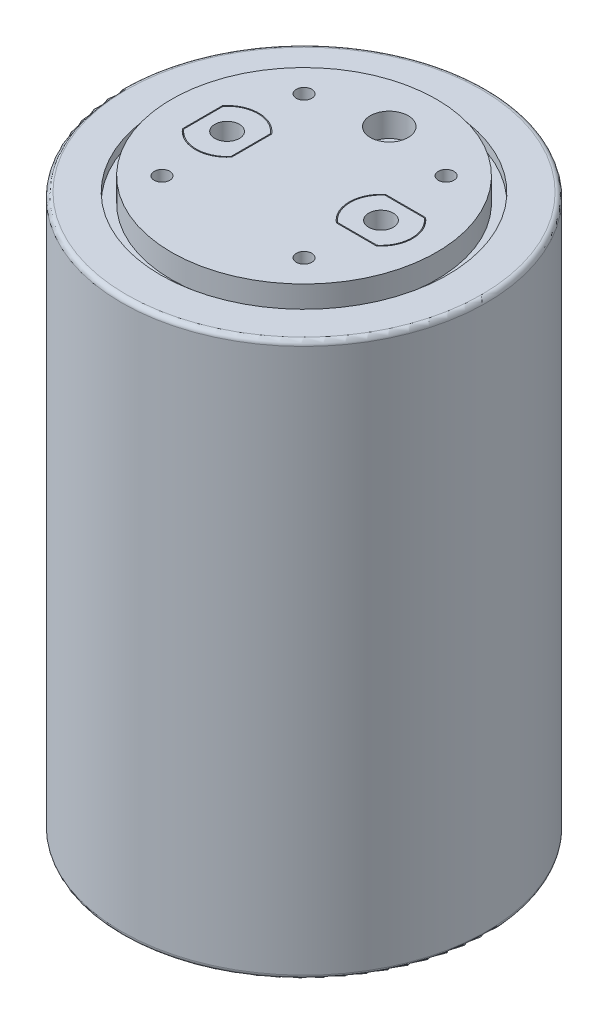
ISO-10303-21;
HEADER;
FILE_DESCRIPTION(('STEP AP214'),'2;1');
FILE_NAME('part.step','',(''),(''),'','','');
FILE_SCHEMA(('AUTOMOTIVE_DESIGN { 1 0 10303 214 1 1 1 1 }'));
ENDSEC;
DATA;
#1=APPLICATION_CONTEXT('core data for automotive mechanical design processes');
#2=APPLICATION_PROTOCOL_DEFINITION('international standard','automotive_design',2000,#1);
#3=PRODUCT_CONTEXT('',#1,'mechanical');
#4=PRODUCT('Part','Part','',(#3));
#5=PRODUCT_RELATED_PRODUCT_CATEGORY('part','',(#4));
#6=PRODUCT_DEFINITION_FORMATION('','',#4);
#7=PRODUCT_DEFINITION_CONTEXT('part definition',#1,'design');
#8=PRODUCT_DEFINITION('design','',#6,#7);
#9=PRODUCT_DEFINITION_SHAPE('','',#8);
#10=(LENGTH_UNIT() NAMED_UNIT(*) SI_UNIT(.MILLI.,.METRE.));
#11=(NAMED_UNIT(*) PLANE_ANGLE_UNIT() SI_UNIT($,.RADIAN.));
#12=(NAMED_UNIT(*) SI_UNIT($,.STERADIAN.) SOLID_ANGLE_UNIT());
#13=UNCERTAINTY_MEASURE_WITH_UNIT(LENGTH_MEASURE(1.E-05),#10,'distance_accuracy_value','');
#14=(GEOMETRIC_REPRESENTATION_CONTEXT(3) GLOBAL_UNCERTAINTY_ASSIGNED_CONTEXT((#13)) GLOBAL_UNIT_ASSIGNED_CONTEXT((#10,
#11,#12)) REPRESENTATION_CONTEXT('',''));
#15=CARTESIAN_POINT('',(0.,0.,0.));
#16=DIRECTION('',(0.,0.,1.));
#17=DIRECTION('',(1.,0.,0.));
#18=AXIS2_PLACEMENT_3D('',#15,#16,#17);
#19=CARTESIAN_POINT('',(1.1478244810946,63.4471649497469,37.8154701534106));
#20=DIRECTION('',(0.,1.,0.));
#21=DIRECTION('',(0.,0.,1.));
#22=AXIS2_PLACEMENT_3D('',#19,#20,#21);
#23=PLANE('',#22);
#24=CARTESIAN_POINT('',(-13.8521755189054,63.4471649497469,52.8154701534106));
#25=DIRECTION('',(0.,1.,0.));
#26=DIRECTION('',(0.,0.,-1.));
#27=AXIS2_PLACEMENT_3D('',#24,#25,#26);
#28=CIRCLE('',#27,1.65);
#29=CARTESIAN_POINT('',(-13.8521755189054,63.4471649497469,51.1654701534106));
#30=VERTEX_POINT('',#29);
#31=EDGE_CURVE('E214',#30,#30,#28,.T.);
#32=ORIENTED_EDGE('',*,*,#31,.F.);
#33=EDGE_LOOP('',(#32));
#34=FACE_BOUND('',#33,.T.);
#35=CARTESIAN_POINT('',(16.1478244810946,63.4471649497469,52.8154701534106));
#36=DIRECTION('',(0.,1.,0.));
#37=DIRECTION('',(0.,0.,1.));
#38=AXIS2_PLACEMENT_3D('',#35,#36,#37);
#39=CIRCLE('',#38,1.65);
#40=CARTESIAN_POINT('',(16.1478244810946,63.4471649497469,54.4654701534106));
#41=VERTEX_POINT('',#40);
#42=EDGE_CURVE('E232',#41,#41,#39,.T.);
#43=ORIENTED_EDGE('',*,*,#42,.F.);
#44=EDGE_LOOP('',(#43));
#45=FACE_BOUND('',#44,.T.);
#46=CARTESIAN_POINT('',(1.1478244810946,63.4471649497469,37.8154701534106));
#47=DIRECTION('',(0.,1.,0.));
#48=DIRECTION('',(0.,0.,1.));
#49=AXIS2_PLACEMENT_3D('',#46,#47,#48);
#50=CIRCLE('',#49,28.);
#51=CARTESIAN_POINT('',(1.1478244810946,63.4471649497469,65.8154701534106));
#52=VERTEX_POINT('',#51);
#53=EDGE_CURVE('E13',#52,#52,#50,.T.);
#54=ORIENTED_EDGE('',*,*,#53,.T.);
#55=EDGE_LOOP('',(#54));
#56=FACE_BOUND('',#55,.T.);
#57=CARTESIAN_POINT('',(-13.8521755189054,63.4471649497469,22.8154701534106));
#58=DIRECTION('',(0.,1.,0.));
#59=DIRECTION('',(0.,0.,-1.));
#60=AXIS2_PLACEMENT_3D('',#57,#58,#59);
#61=CIRCLE('',#60,1.65);
#62=CARTESIAN_POINT('',(-13.8521755189054,63.4471649497469,21.1654701534106));
#63=VERTEX_POINT('',#62);
#64=EDGE_CURVE('E240',#63,#63,#61,.T.);
#65=ORIENTED_EDGE('',*,*,#64,.F.);
#66=EDGE_LOOP('',(#65));
#67=FACE_BOUND('',#66,.T.);
#68=CARTESIAN_POINT('',(16.1478244810946,63.4471649497469,22.8154701534106));
#69=DIRECTION('',(0.,1.,0.));
#70=DIRECTION('',(0.,0.,1.));
#71=AXIS2_PLACEMENT_3D('',#68,#69,#70);
#72=CIRCLE('',#71,1.65);
#73=CARTESIAN_POINT('',(16.1478244810946,63.4471649497469,24.4654701534106));
#74=VERTEX_POINT('',#73);
#75=EDGE_CURVE('E222',#74,#74,#72,.T.);
#76=ORIENTED_EDGE('',*,*,#75,.F.);
#77=EDGE_LOOP('',(#76));
#78=FACE_BOUND('',#77,.T.);
#79=CARTESIAN_POINT('',(1.1478244810946,63.4471649497469,19.8154701534106));
#80=DIRECTION('',(0.,1.,0.));
#81=DIRECTION('',(0.,0.,1.));
#82=AXIS2_PLACEMENT_3D('',#79,#80,#81);
#83=CIRCLE('',#82,4.);
#84=CARTESIAN_POINT('',(1.1478244810946,63.4471649497469,23.8154701534106));
#85=VERTEX_POINT('',#84);
#86=EDGE_CURVE('E207',#85,#85,#83,.T.);
#87=ORIENTED_EDGE('',*,*,#86,.F.);
#88=EDGE_LOOP('',(#87));
#89=FACE_BOUND('',#88,.T.);
#90=DIRECTION('',(0.,0.,1.));
#91=VECTOR('',#90,1.);
#92=CARTESIAN_POINT('',(-20.3021755189054,63.4471649497469,33.5905441185551));
#93=LINE('',#92,#91);
#94=CARTESIAN_POINT('',(-20.3021755189054,63.4471649497469,33.5905441185551));
#95=VERTEX_POINT('',#94);
#96=CARTESIAN_POINT('',(-20.3021755189054,63.4471649497469,42.0403961882661));
#97=VERTEX_POINT('',#96);
#98=EDGE_CURVE('E167',#95,#97,#93,.T.);
#99=ORIENTED_EDGE('',*,*,#98,.F.);
#100=CARTESIAN_POINT('',(-15.1021755189054,63.4471649497469,37.8154701534106));
#101=DIRECTION('',(0.,1.,0.));
#102=DIRECTION('',(0.,0.,1.));
#103=AXIS2_PLACEMENT_3D('',#100,#101,#102);
#104=CIRCLE('',#103,6.69999999999999);
#105=CARTESIAN_POINT('',(-9.9021755189054,63.4471649497469,33.5905441185551));
#106=VERTEX_POINT('',#105);
#107=EDGE_CURVE('E165',#106,#95,#104,.T.);
#108=ORIENTED_EDGE('',*,*,#107,.F.);
#109=DIRECTION('',(0.,0.,-1.));
#110=VECTOR('',#109,1.);
#111=CARTESIAN_POINT('',(-9.9021755189054,63.4471649497469,42.0403961882661));
#112=LINE('',#111,#110);
#113=CARTESIAN_POINT('',(-9.9021755189054,63.4471649497469,42.0403961882661));
#114=VERTEX_POINT('',#113);
#115=EDGE_CURVE('E173',#114,#106,#112,.T.);
#116=ORIENTED_EDGE('',*,*,#115,.F.);
#117=CARTESIAN_POINT('',(-15.1021755189054,63.4471649497469,37.8154701534106));
#118=DIRECTION('',(0.,1.,0.));
#119=DIRECTION('',(0.,0.,1.));
#120=AXIS2_PLACEMENT_3D('',#117,#118,#119);
#121=CIRCLE('',#120,6.7);
#122=EDGE_CURVE('E170',#97,#114,#121,.T.);
#123=ORIENTED_EDGE('',*,*,#122,.F.);
#124=EDGE_LOOP('',(#99,#108,#116,#123));
#125=FACE_BOUND('',#124,.T.);
#126=DIRECTION('',(-1.,0.,0.));
#127=VECTOR('',#126,1.);
#128=CARTESIAN_POINT('',(21.6227505159501,63.4471649497469,32.6154701534106));
#129=LINE('',#128,#127);
#130=CARTESIAN_POINT('',(21.6227505159501,63.4471649497469,32.6154701534106));
#131=VERTEX_POINT('',#130);
#132=CARTESIAN_POINT('',(13.1728984462391,63.4471649497469,32.6154701534106));
#133=VERTEX_POINT('',#132);
#134=EDGE_CURVE('E126',#131,#133,#129,.T.);
#135=ORIENTED_EDGE('',*,*,#134,.F.);
#136=CARTESIAN_POINT('',(17.3978244810946,63.4471649497469,37.8154701534106));
#137=DIRECTION('',(0.,1.,0.));
#138=DIRECTION('',(0.,0.,1.));
#139=AXIS2_PLACEMENT_3D('',#136,#137,#138);
#140=CIRCLE('',#139,6.7);
#141=CARTESIAN_POINT('',(21.6227505159501,63.4471649497469,43.0154701534106));
#142=VERTEX_POINT('',#141);
#143=EDGE_CURVE('E118',#142,#131,#140,.T.);
#144=ORIENTED_EDGE('',*,*,#143,.F.);
#145=DIRECTION('',(1.,0.,0.));
#146=VECTOR('',#145,1.);
#147=CARTESIAN_POINT('',(13.1728984462391,63.4471649497469,43.0154701534106));
#148=LINE('',#147,#146);
#149=CARTESIAN_POINT('',(13.1728984462391,63.4471649497469,43.0154701534106));
#150=VERTEX_POINT('',#149);
#151=EDGE_CURVE('E140',#150,#142,#148,.T.);
#152=ORIENTED_EDGE('',*,*,#151,.F.);
#153=CARTESIAN_POINT('',(17.3978244810946,63.4471649497469,37.8154701534106));
#154=DIRECTION('',(0.,1.,0.));
#155=DIRECTION('',(0.,0.,1.));
#156=AXIS2_PLACEMENT_3D('',#153,#154,#155);
#157=CIRCLE('',#156,6.70000000000001);
#158=EDGE_CURVE('E138',#133,#150,#157,.T.);
#159=ORIENTED_EDGE('',*,*,#158,.F.);
#160=EDGE_LOOP('',(#135,#144,#152,#159));
#161=FACE_BOUND('',#160,.T.);
#162=ADVANCED_FACE('F52',(#34,#45,#56,#67,#78,#89,#125,#161),#23,.T.);
#163=CARTESIAN_POINT('',(1.1478244810946,58.4471649497469,37.8154701534106));
#164=DIRECTION('',(0.,1.,0.));
#165=DIRECTION('',(0.,0.,1.));
#166=AXIS2_PLACEMENT_3D('',#163,#164,#165);
#167=PLANE('',#166);
#168=CARTESIAN_POINT('',(-15.1021755189054,58.4471649497469,37.8154701534106));
#169=DIRECTION('',(0.,1.,0.));
#170=DIRECTION('',(0.,0.,1.));
#171=AXIS2_PLACEMENT_3D('',#168,#169,#170);
#172=CIRCLE('',#171,6.69999999999999);
#173=CARTESIAN_POINT('',(-9.9021755189054,58.4471649497469,33.5905441185551));
#174=VERTEX_POINT('',#173);
#175=CARTESIAN_POINT('',(-20.3021755189054,58.4471649497469,33.5905441185551));
#176=VERTEX_POINT('',#175);
#177=EDGE_CURVE('E134',#174,#176,#172,.T.);
#178=ORIENTED_EDGE('',*,*,#177,.T.);
#179=DIRECTION('',(0.,0.,1.));
#180=VECTOR('',#179,1.);
#181=CARTESIAN_POINT('',(-20.3021755189054,58.4471649497469,33.5905441185551));
#182=LINE('',#181,#180);
#183=CARTESIAN_POINT('',(-20.3021755189054,58.4471649497469,42.0403961882661));
#184=VERTEX_POINT('',#183);
#185=EDGE_CURVE('E180',#176,#184,#182,.T.);
#186=ORIENTED_EDGE('',*,*,#185,.T.);
#187=CARTESIAN_POINT('',(-15.1021755189054,58.4471649497469,37.8154701534106));
#188=DIRECTION('',(0.,1.,0.));
#189=DIRECTION('',(0.,0.,1.));
#190=AXIS2_PLACEMENT_3D('',#187,#188,#189);
#191=CIRCLE('',#190,6.7);
#192=CARTESIAN_POINT('',(-9.9021755189054,58.4471649497469,42.0403961882661));
#193=VERTEX_POINT('',#192);
#194=EDGE_CURVE('E189',#184,#193,#191,.T.);
#195=ORIENTED_EDGE('',*,*,#194,.T.);
#196=DIRECTION('',(0.,0.,-1.));
#197=VECTOR('',#196,1.);
#198=CARTESIAN_POINT('',(-9.9021755189054,58.4471649497469,42.0403961882661));
#199=LINE('',#198,#197);
#200=EDGE_CURVE('E168',#193,#174,#199,.T.);
#201=ORIENTED_EDGE('',*,*,#200,.T.);
#202=EDGE_LOOP('',(#178,#186,#195,#201));
#203=FACE_BOUND('',#202,.T.);
#204=CARTESIAN_POINT('',(1.1478244810946,58.4471649497469,37.8154701534106));
#205=DIRECTION('',(0.,1.,0.));
#206=DIRECTION('',(0.,0.,1.));
#207=AXIS2_PLACEMENT_3D('',#204,#205,#206);
#208=CIRCLE('',#207,28.);
#209=CARTESIAN_POINT('',(1.1478244810946,58.4471649497469,65.8154701534106));
#210=VERTEX_POINT('',#209);
#211=EDGE_CURVE('E56',#210,#210,#208,.T.);
#212=ORIENTED_EDGE('',*,*,#211,.F.);
#213=EDGE_LOOP('',(#212));
#214=FACE_BOUND('',#213,.T.);
#215=CARTESIAN_POINT('',(-13.8521755189054,58.4471649497469,22.8154701534106));
#216=DIRECTION('',(0.,1.,0.));
#217=DIRECTION('',(0.,0.,-1.));
#218=AXIS2_PLACEMENT_3D('',#215,#216,#217);
#219=CIRCLE('',#218,1.65);
#220=CARTESIAN_POINT('',(-13.8521755189054,58.4471649497469,21.1654701534106));
#221=VERTEX_POINT('',#220);
#222=EDGE_CURVE('E234',#221,#221,#219,.T.);
#223=ORIENTED_EDGE('',*,*,#222,.T.);
#224=EDGE_LOOP('',(#223));
#225=FACE_BOUND('',#224,.T.);
#226=CARTESIAN_POINT('',(16.1478244810946,58.4471649497469,52.8154701534106));
#227=DIRECTION('',(0.,1.,0.));
#228=DIRECTION('',(0.,0.,1.));
#229=AXIS2_PLACEMENT_3D('',#226,#227,#228);
#230=CIRCLE('',#229,1.65);
#231=CARTESIAN_POINT('',(16.1478244810946,58.4471649497469,54.4654701534106));
#232=VERTEX_POINT('',#231);
#233=EDGE_CURVE('E235',#232,#232,#230,.T.);
#234=ORIENTED_EDGE('',*,*,#233,.T.);
#235=EDGE_LOOP('',(#234));
#236=FACE_BOUND('',#235,.T.);
#237=CARTESIAN_POINT('',(16.1478244810946,58.4471649497469,22.8154701534106));
#238=DIRECTION('',(0.,1.,0.));
#239=DIRECTION('',(0.,0.,1.));
#240=AXIS2_PLACEMENT_3D('',#237,#238,#239);
#241=CIRCLE('',#240,1.65);
#242=CARTESIAN_POINT('',(16.1478244810946,58.4471649497469,24.4654701534106));
#243=VERTEX_POINT('',#242);
#244=EDGE_CURVE('E217',#243,#243,#241,.T.);
#245=ORIENTED_EDGE('',*,*,#244,.T.);
#246=EDGE_LOOP('',(#245));
#247=FACE_BOUND('',#246,.T.);
#248=CARTESIAN_POINT('',(-13.8521755189054,58.4471649497469,52.8154701534106));
#249=DIRECTION('',(0.,1.,0.));
#250=DIRECTION('',(0.,0.,-1.));
#251=AXIS2_PLACEMENT_3D('',#248,#249,#250);
#252=CIRCLE('',#251,1.65);
#253=CARTESIAN_POINT('',(-13.8521755189054,58.4471649497469,51.1654701534106));
#254=VERTEX_POINT('',#253);
#255=EDGE_CURVE('E209',#254,#254,#252,.T.);
#256=ORIENTED_EDGE('',*,*,#255,.T.);
#257=EDGE_LOOP('',(#256));
#258=FACE_BOUND('',#257,.T.);
#259=CARTESIAN_POINT('',(1.1478244810946,58.4471649497469,19.8154701534106));
#260=DIRECTION('',(0.,1.,0.));
#261=DIRECTION('',(0.,0.,1.));
#262=AXIS2_PLACEMENT_3D('',#259,#260,#261);
#263=CIRCLE('',#262,4.);
#264=CARTESIAN_POINT('',(1.1478244810946,58.4471649497469,23.8154701534106));
#265=VERTEX_POINT('',#264);
#266=EDGE_CURVE('E206',#265,#265,#263,.T.);
#267=ORIENTED_EDGE('',*,*,#266,.T.);
#268=EDGE_LOOP('',(#267));
#269=FACE_BOUND('',#268,.T.);
#270=CARTESIAN_POINT('',(17.3978244810946,58.4471649497469,37.8154701534106));
#271=DIRECTION('',(0.,1.,0.));
#272=DIRECTION('',(0.,0.,1.));
#273=AXIS2_PLACEMENT_3D('',#270,#271,#272);
#274=CIRCLE('',#273,6.7);
#275=CARTESIAN_POINT('',(21.6227505159501,58.4471649497469,43.0154701534106));
#276=VERTEX_POINT('',#275);
#277=CARTESIAN_POINT('',(21.6227505159501,58.4471649497469,32.6154701534106));
#278=VERTEX_POINT('',#277);
#279=EDGE_CURVE('E76',#276,#278,#274,.T.);
#280=ORIENTED_EDGE('',*,*,#279,.T.);
#281=DIRECTION('',(-1.,0.,0.));
#282=VECTOR('',#281,1.);
#283=CARTESIAN_POINT('',(21.6227505159501,58.4471649497469,32.6154701534106));
#284=LINE('',#283,#282);
#285=CARTESIAN_POINT('',(13.1728984462391,58.4471649497469,32.6154701534106));
#286=VERTEX_POINT('',#285);
#287=EDGE_CURVE('E133',#278,#286,#284,.T.);
#288=ORIENTED_EDGE('',*,*,#287,.T.);
#289=CARTESIAN_POINT('',(17.3978244810946,58.4471649497469,37.8154701534106));
#290=DIRECTION('',(0.,1.,0.));
#291=DIRECTION('',(0.,0.,1.));
#292=AXIS2_PLACEMENT_3D('',#289,#290,#291);
#293=CIRCLE('',#292,6.70000000000001);
#294=CARTESIAN_POINT('',(13.1728984462391,58.4471649497469,43.0154701534106));
#295=VERTEX_POINT('',#294);
#296=EDGE_CURVE('E154',#286,#295,#293,.T.);
#297=ORIENTED_EDGE('',*,*,#296,.T.);
#298=DIRECTION('',(1.,0.,0.));
#299=VECTOR('',#298,1.);
#300=CARTESIAN_POINT('',(13.1728984462391,58.4471649497469,43.0154701534106));
#301=LINE('',#300,#299);
#302=EDGE_CURVE('E127',#295,#276,#301,.T.);
#303=ORIENTED_EDGE('',*,*,#302,.T.);
#304=EDGE_LOOP('',(#280,#288,#297,#303));
#305=FACE_BOUND('',#304,.T.);
#306=ADVANCED_FACE('F249',(#203,#214,#225,#236,#247,#258,#269,#305),#167,.F.);
#307=CARTESIAN_POINT('',(1.1478244810946,63.4471649497469,37.8154701534106));
#308=DIRECTION('',(0.,-1.,0.));
#309=DIRECTION('',(0.,0.,-1.));
#310=AXIS2_PLACEMENT_3D('',#307,#308,#309);
#311=CYLINDRICAL_SURFACE('',#310,28.);
#312=ORIENTED_EDGE('',*,*,#53,.F.);
#313=EDGE_LOOP('',(#312));
#314=FACE_BOUND('',#313,.T.);
#315=ORIENTED_EDGE('',*,*,#211,.T.);
#316=EDGE_LOOP('',(#315));
#317=FACE_BOUND('',#316,.T.);
#318=ADVANCED_FACE('F54',(#314,#317),#311,.T.);
#319=CARTESIAN_POINT('',(-13.8521755189054,63.4471649497469,22.8154701534106));
#320=DIRECTION('',(0.,-1.,0.));
#321=DIRECTION('',(0.,0.,-1.));
#322=AXIS2_PLACEMENT_3D('',#319,#320,#321);
#323=CYLINDRICAL_SURFACE('',#322,1.65);
#324=ORIENTED_EDGE('',*,*,#64,.T.);
#325=EDGE_LOOP('',(#324));
#326=FACE_BOUND('',#325,.T.);
#327=ORIENTED_EDGE('',*,*,#222,.F.);
#328=EDGE_LOOP('',(#327));
#329=FACE_BOUND('',#328,.T.);
#330=ADVANCED_FACE('F252',(#326,#329),#323,.F.);
#331=CARTESIAN_POINT('',(16.1478244810946,63.4471649497469,52.8154701534106));
#332=DIRECTION('',(0.,-1.,0.));
#333=DIRECTION('',(0.,0.,-1.));
#334=AXIS2_PLACEMENT_3D('',#331,#332,#333);
#335=CYLINDRICAL_SURFACE('',#334,1.65);
#336=ORIENTED_EDGE('',*,*,#42,.T.);
#337=EDGE_LOOP('',(#336));
#338=FACE_BOUND('',#337,.T.);
#339=ORIENTED_EDGE('',*,*,#233,.F.);
#340=EDGE_LOOP('',(#339));
#341=FACE_BOUND('',#340,.T.);
#342=ADVANCED_FACE('F254',(#338,#341),#335,.F.);
#343=CARTESIAN_POINT('',(16.1478244810946,63.4471649497469,22.8154701534106));
#344=DIRECTION('',(0.,-1.,0.));
#345=DIRECTION('',(0.,0.,-1.));
#346=AXIS2_PLACEMENT_3D('',#343,#344,#345);
#347=CYLINDRICAL_SURFACE('',#346,1.65);
#348=ORIENTED_EDGE('',*,*,#75,.T.);
#349=EDGE_LOOP('',(#348));
#350=FACE_BOUND('',#349,.T.);
#351=ORIENTED_EDGE('',*,*,#244,.F.);
#352=EDGE_LOOP('',(#351));
#353=FACE_BOUND('',#352,.T.);
#354=ADVANCED_FACE('F261',(#350,#353),#347,.F.);
#355=CARTESIAN_POINT('',(-13.8521755189054,63.4471649497469,52.8154701534106));
#356=DIRECTION('',(0.,-1.,0.));
#357=DIRECTION('',(0.,0.,-1.));
#358=AXIS2_PLACEMENT_3D('',#355,#356,#357);
#359=CYLINDRICAL_SURFACE('',#358,1.65);
#360=ORIENTED_EDGE('',*,*,#31,.T.);
#361=EDGE_LOOP('',(#360));
#362=FACE_BOUND('',#361,.T.);
#363=ORIENTED_EDGE('',*,*,#255,.F.);
#364=EDGE_LOOP('',(#363));
#365=FACE_BOUND('',#364,.T.);
#366=ADVANCED_FACE('F325',(#362,#365),#359,.F.);
#367=CARTESIAN_POINT('',(1.1478244810946,63.4471649497469,19.8154701534106));
#368=DIRECTION('',(0.,-1.,0.));
#369=DIRECTION('',(0.,0.,-1.));
#370=AXIS2_PLACEMENT_3D('',#367,#368,#369);
#371=CYLINDRICAL_SURFACE('',#370,4.);
#372=ORIENTED_EDGE('',*,*,#86,.T.);
#373=EDGE_LOOP('',(#372));
#374=FACE_BOUND('',#373,.T.);
#375=ORIENTED_EDGE('',*,*,#266,.F.);
#376=EDGE_LOOP('',(#375));
#377=FACE_BOUND('',#376,.T.);
#378=ADVANCED_FACE('F322',(#374,#377),#371,.F.);
#379=CARTESIAN_POINT('',(-15.1021755189054,63.4471649497469,37.8154701534106));
#380=DIRECTION('',(0.,-1.,0.));
#381=DIRECTION('',(0.,0.,-1.));
#382=AXIS2_PLACEMENT_3D('',#379,#380,#381);
#383=CYLINDRICAL_SURFACE('',#382,6.69999999999999);
#384=ORIENTED_EDGE('',*,*,#177,.F.);
#385=DIRECTION('',(0.,-1.,0.));
#386=VECTOR('',#385,1.);
#387=CARTESIAN_POINT('',(-9.9021755189054,63.4471649497469,33.5905441185551));
#388=LINE('',#387,#386);
#389=EDGE_CURVE('E175',#106,#174,#388,.T.);
#390=ORIENTED_EDGE('',*,*,#389,.F.);
#391=ORIENTED_EDGE('',*,*,#107,.T.);
#392=DIRECTION('',(0.,-1.,0.));
#393=VECTOR('',#392,1.);
#394=CARTESIAN_POINT('',(-20.3021755189054,63.4471649497469,33.5905441185551));
#395=LINE('',#394,#393);
#396=EDGE_CURVE('E203',#95,#176,#395,.T.);
#397=ORIENTED_EDGE('',*,*,#396,.T.);
#398=EDGE_LOOP('',(#384,#390,#391,#397));
#399=FACE_BOUND('',#398,.T.);
#400=ADVANCED_FACE('F304',(#399),#383,.F.);
#401=CARTESIAN_POINT('',(-20.3021755189054,63.4471649497469,33.5905441185551));
#402=DIRECTION('',(1.,0.,0.));
#403=DIRECTION('',(0.,0.,-1.));
#404=AXIS2_PLACEMENT_3D('',#401,#402,#403);
#405=PLANE('',#404);
#406=ORIENTED_EDGE('',*,*,#185,.F.);
#407=ORIENTED_EDGE('',*,*,#396,.F.);
#408=ORIENTED_EDGE('',*,*,#98,.T.);
#409=DIRECTION('',(0.,-1.,0.));
#410=VECTOR('',#409,1.);
#411=CARTESIAN_POINT('',(-20.3021755189054,63.4471649497469,42.0403961882661));
#412=LINE('',#411,#410);
#413=EDGE_CURVE('E201',#97,#184,#412,.T.);
#414=ORIENTED_EDGE('',*,*,#413,.T.);
#415=EDGE_LOOP('',(#406,#407,#408,#414));
#416=FACE_BOUND('',#415,.T.);
#417=ADVANCED_FACE('F292',(#416),#405,.T.);
#418=CARTESIAN_POINT('',(-15.1021755189054,63.4471649497469,37.8154701534106));
#419=DIRECTION('',(0.,-1.,0.));
#420=DIRECTION('',(0.,0.,-1.));
#421=AXIS2_PLACEMENT_3D('',#418,#419,#420);
#422=CYLINDRICAL_SURFACE('',#421,6.7);
#423=ORIENTED_EDGE('',*,*,#194,.F.);
#424=ORIENTED_EDGE('',*,*,#413,.F.);
#425=ORIENTED_EDGE('',*,*,#122,.T.);
#426=DIRECTION('',(0.,-1.,0.));
#427=VECTOR('',#426,1.);
#428=CARTESIAN_POINT('',(-9.9021755189054,63.4471649497469,42.0403961882661));
#429=LINE('',#428,#427);
#430=EDGE_CURVE('E199',#114,#193,#429,.T.);
#431=ORIENTED_EDGE('',*,*,#430,.T.);
#432=EDGE_LOOP('',(#423,#424,#425,#431));
#433=FACE_BOUND('',#432,.T.);
#434=ADVANCED_FACE('F295',(#433),#422,.F.);
#435=CARTESIAN_POINT('',(-9.9021755189054,63.4471649497469,42.0403961882661));
#436=DIRECTION('',(-1.,0.,0.));
#437=DIRECTION('',(0.,0.,1.));
#438=AXIS2_PLACEMENT_3D('',#435,#436,#437);
#439=PLANE('',#438);
#440=ORIENTED_EDGE('',*,*,#200,.F.);
#441=ORIENTED_EDGE('',*,*,#430,.F.);
#442=ORIENTED_EDGE('',*,*,#115,.T.);
#443=ORIENTED_EDGE('',*,*,#389,.T.);
#444=EDGE_LOOP('',(#440,#441,#442,#443));
#445=FACE_BOUND('',#444,.T.);
#446=ADVANCED_FACE('F307',(#445),#439,.T.);
#447=CARTESIAN_POINT('',(17.3978244810946,63.4471649497469,37.8154701534106));
#448=DIRECTION('',(0.,-1.,0.));
#449=DIRECTION('',(0.,0.,-1.));
#450=AXIS2_PLACEMENT_3D('',#447,#448,#449);
#451=CYLINDRICAL_SURFACE('',#450,6.7);
#452=ORIENTED_EDGE('',*,*,#279,.F.);
#453=DIRECTION('',(0.,-1.,0.));
#454=VECTOR('',#453,1.);
#455=CARTESIAN_POINT('',(21.6227505159501,63.4471649497469,43.0154701534106));
#456=LINE('',#455,#454);
#457=EDGE_CURVE('E122',#142,#276,#456,.T.);
#458=ORIENTED_EDGE('',*,*,#457,.F.);
#459=ORIENTED_EDGE('',*,*,#143,.T.);
#460=DIRECTION('',(0.,-1.,0.));
#461=VECTOR('',#460,1.);
#462=CARTESIAN_POINT('',(21.6227505159501,63.4471649497469,32.6154701534106));
#463=LINE('',#462,#461);
#464=EDGE_CURVE('E121',#131,#278,#463,.T.);
#465=ORIENTED_EDGE('',*,*,#464,.T.);
#466=EDGE_LOOP('',(#452,#458,#459,#465));
#467=FACE_BOUND('',#466,.T.);
#468=ADVANCED_FACE('F120',(#467),#451,.F.);
#469=CARTESIAN_POINT('',(21.6227505159501,63.4471649497469,32.6154701534106));
#470=DIRECTION('',(0.,0.,1.));
#471=DIRECTION('',(1.,0.,0.));
#472=AXIS2_PLACEMENT_3D('',#469,#470,#471);
#473=PLANE('',#472);
#474=ORIENTED_EDGE('',*,*,#287,.F.);
#475=ORIENTED_EDGE('',*,*,#464,.F.);
#476=ORIENTED_EDGE('',*,*,#134,.T.);
#477=DIRECTION('',(0.,-1.,0.));
#478=VECTOR('',#477,1.);
#479=CARTESIAN_POINT('',(13.1728984462391,63.4471649497469,32.6154701534106));
#480=LINE('',#479,#478);
#481=EDGE_CURVE('E135',#133,#286,#480,.T.);
#482=ORIENTED_EDGE('',*,*,#481,.T.);
#483=EDGE_LOOP('',(#474,#475,#476,#482));
#484=FACE_BOUND('',#483,.T.);
#485=ADVANCED_FACE('F130',(#484),#473,.T.);
#486=CARTESIAN_POINT('',(17.3978244810946,63.4471649497469,37.8154701534106));
#487=DIRECTION('',(0.,-1.,0.));
#488=DIRECTION('',(0.,0.,-1.));
#489=AXIS2_PLACEMENT_3D('',#486,#487,#488);
#490=CYLINDRICAL_SURFACE('',#489,6.70000000000001);
#491=ORIENTED_EDGE('',*,*,#296,.F.);
#492=ORIENTED_EDGE('',*,*,#481,.F.);
#493=ORIENTED_EDGE('',*,*,#158,.T.);
#494=DIRECTION('',(0.,-1.,0.));
#495=VECTOR('',#494,1.);
#496=CARTESIAN_POINT('',(13.1728984462391,63.4471649497469,43.0154701534106));
#497=LINE('',#496,#495);
#498=EDGE_CURVE('E68',#150,#295,#497,.T.);
#499=ORIENTED_EDGE('',*,*,#498,.T.);
#500=EDGE_LOOP('',(#491,#492,#493,#499));
#501=FACE_BOUND('',#500,.T.);
#502=ADVANCED_FACE('F345',(#501),#490,.F.);
#503=CARTESIAN_POINT('',(13.1728984462391,63.4471649497469,43.0154701534106));
#504=DIRECTION('',(0.,0.,-1.));
#505=DIRECTION('',(-1.,0.,0.));
#506=AXIS2_PLACEMENT_3D('',#503,#504,#505);
#507=PLANE('',#506);
#508=ORIENTED_EDGE('',*,*,#302,.F.);
#509=ORIENTED_EDGE('',*,*,#498,.F.);
#510=ORIENTED_EDGE('',*,*,#151,.T.);
#511=ORIENTED_EDGE('',*,*,#457,.T.);
#512=EDGE_LOOP('',(#508,#509,#510,#511));
#513=FACE_BOUND('',#512,.T.);
#514=ADVANCED_FACE('F343',(#513),#507,.T.);
#515=CLOSED_SHELL('',(#162,#306,#318,#330,#342,#354,#366,#378,#400,#417,#434,#446,#468,#485,
#502,#514));
#516=MANIFOLD_SOLID_BREP('B2',#515);
#517=CARTESIAN_POINT('',(1.1478244810946,58.4471649497469,37.8154701534106));
#518=DIRECTION('',(0.,1.,0.));
#519=DIRECTION('',(0.,0.,1.));
#520=AXIS2_PLACEMENT_3D('',#517,#518,#519);
#521=PLANE('',#520);
#522=DIRECTION('',(0.,0.,1.));
#523=VECTOR('',#522,1.);
#524=CARTESIAN_POINT('',(-20.1021755189054,58.4471649497469,33.6621582219516));
#525=LINE('',#524,#523);
#526=CARTESIAN_POINT('',(-20.1021755189054,58.4471649497469,33.6621582219516));
#527=VERTEX_POINT('',#526);
#528=CARTESIAN_POINT('',(-20.1021755189054,58.4471649497469,41.9687820848696));
#529=VERTEX_POINT('',#528);
#530=EDGE_CURVE('E560',#527,#529,#525,.T.);
#531=ORIENTED_EDGE('',*,*,#530,.F.);
#532=CARTESIAN_POINT('',(-15.1021755189054,58.4471649497469,37.8154701534106));
#533=DIRECTION('',(0.,1.,0.));
#534=DIRECTION('',(0.,0.,1.));
#535=AXIS2_PLACEMENT_3D('',#532,#533,#534);
#536=CIRCLE('',#535,6.5);
#537=CARTESIAN_POINT('',(-10.1021755189054,58.4471649497469,33.6621582219516));
#538=VERTEX_POINT('',#537);
#539=EDGE_CURVE('E542',#538,#527,#536,.T.);
#540=ORIENTED_EDGE('',*,*,#539,.F.);
#541=DIRECTION('',(0.,0.,-1.));
#542=VECTOR('',#541,1.);
#543=CARTESIAN_POINT('',(-10.1021755189054,58.4471649497469,41.9687820848696));
#544=LINE('',#543,#542);
#545=CARTESIAN_POINT('',(-10.1021755189054,58.4471649497469,41.9687820848696));
#546=VERTEX_POINT('',#545);
#547=EDGE_CURVE('E551',#546,#538,#544,.T.);
#548=ORIENTED_EDGE('',*,*,#547,.F.);
#549=CARTESIAN_POINT('',(-15.1021755189054,58.4471649497469,37.8154701534106));
#550=DIRECTION('',(0.,1.,0.));
#551=DIRECTION('',(0.,0.,-1.));
#552=AXIS2_PLACEMENT_3D('',#549,#550,#551);
#553=CIRCLE('',#552,6.5);
#554=EDGE_CURVE('E562',#529,#546,#553,.T.);
#555=ORIENTED_EDGE('',*,*,#554,.F.);
#556=EDGE_LOOP('',(#531,#540,#548,#555));
#557=FACE_BOUND('',#556,.T.);
#558=DIRECTION('',(-1.,0.,0.));
#559=VECTOR('',#558,1.);
#560=CARTESIAN_POINT('',(13.2445125496356,58.4471649497469,32.8154701534106));
#561=LINE('',#560,#559);
#562=CARTESIAN_POINT('',(21.5511364125536,58.4471649497469,32.8154701534106));
#563=VERTEX_POINT('',#562);
#564=CARTESIAN_POINT('',(13.2445125496356,58.4471649497469,32.8154701534106));
#565=VERTEX_POINT('',#564);
#566=EDGE_CURVE('E827',#563,#565,#561,.T.);
#567=ORIENTED_EDGE('',*,*,#566,.F.);
#568=CARTESIAN_POINT('',(17.3978244810946,58.4471649497469,37.8154701534106));
#569=DIRECTION('',(0.,1.,0.));
#570=DIRECTION('',(0.,0.,-1.));
#571=AXIS2_PLACEMENT_3D('',#568,#569,#570);
#572=CIRCLE('',#571,6.5);
#573=CARTESIAN_POINT('',(21.5511364125536,58.4471649497469,42.8154701534106));
#574=VERTEX_POINT('',#573);
#575=EDGE_CURVE('E537',#574,#563,#572,.T.);
#576=ORIENTED_EDGE('',*,*,#575,.F.);
#577=DIRECTION('',(1.,0.,0.));
#578=VECTOR('',#577,1.);
#579=CARTESIAN_POINT('',(21.5511364125536,58.4471649497469,42.8154701534106));
#580=LINE('',#579,#578);
#581=CARTESIAN_POINT('',(13.2445125496356,58.4471649497469,42.8154701534106));
#582=VERTEX_POINT('',#581);
#583=EDGE_CURVE('E533',#582,#574,#580,.T.);
#584=ORIENTED_EDGE('',*,*,#583,.F.);
#585=CARTESIAN_POINT('',(17.3978244810946,58.4471649497469,37.8154701534106));
#586=DIRECTION('',(0.,1.,0.));
#587=DIRECTION('',(0.,0.,1.));
#588=AXIS2_PLACEMENT_3D('',#585,#586,#587);
#589=CIRCLE('',#588,6.50000000000001);
#590=EDGE_CURVE('E829',#565,#582,#589,.T.);
#591=ORIENTED_EDGE('',*,*,#590,.F.);
#592=EDGE_LOOP('',(#567,#576,#584,#591));
#593=FACE_BOUND('',#592,.T.);
#594=CARTESIAN_POINT('',(1.1478244810946,58.4471649497469,37.8154701534106));
#595=DIRECTION('',(0.,1.,0.));
#596=DIRECTION('',(0.,0.,1.));
#597=AXIS2_PLACEMENT_3D('',#594,#595,#596);
#598=CIRCLE('',#597,30.3);
#599=CARTESIAN_POINT('',(1.1478244810946,58.4471649497469,68.1154701534106));
#600=VERTEX_POINT('',#599);
#601=EDGE_CURVE('E579',#600,#600,#598,.F.);
#602=ORIENTED_EDGE('',*,*,#601,.F.);
#603=EDGE_LOOP('',(#602));
#604=FACE_BOUND('',#603,.T.);
#605=ADVANCED_FACE('F447',(#557,#593,#604),#521,.T.);
#606=CARTESIAN_POINT('',(-15.1021755189054,63.4471649497469,37.8154701534106));
#607=DIRECTION('',(0.,1.,0.));
#608=DIRECTION('',(0.,0.,1.));
#609=AXIS2_PLACEMENT_3D('',#606,#607,#608);
#610=PLANE('',#609);
#611=CARTESIAN_POINT('',(-15.1021755189054,63.4471649497469,37.8154701534106));
#612=DIRECTION('',(0.,1.,0.));
#613=DIRECTION('',(0.,0.,1.));
#614=AXIS2_PLACEMENT_3D('',#611,#612,#613);
#615=CIRCLE('',#614,6.5);
#616=CARTESIAN_POINT('',(-10.1021755189054,63.4471649497469,33.6621582219516));
#617=VERTEX_POINT('',#616);
#618=CARTESIAN_POINT('',(-20.1021755189054,63.4471649497469,33.6621582219516));
#619=VERTEX_POINT('',#618);
#620=EDGE_CURVE('E547',#617,#619,#615,.T.);
#621=ORIENTED_EDGE('',*,*,#620,.T.);
#622=DIRECTION('',(0.,0.,1.));
#623=VECTOR('',#622,1.);
#624=CARTESIAN_POINT('',(-20.1021755189054,63.4471649497469,33.6621582219516));
#625=LINE('',#624,#623);
#626=CARTESIAN_POINT('',(-20.1021755189054,63.4471649497469,41.9687820848696));
#627=VERTEX_POINT('',#626);
#628=EDGE_CURVE('E550',#619,#627,#625,.T.);
#629=ORIENTED_EDGE('',*,*,#628,.T.);
#630=CARTESIAN_POINT('',(-15.1021755189054,63.4471649497469,37.8154701534106));
#631=DIRECTION('',(0.,1.,0.));
#632=DIRECTION('',(0.,0.,-1.));
#633=AXIS2_PLACEMENT_3D('',#630,#631,#632);
#634=CIRCLE('',#633,6.5);
#635=CARTESIAN_POINT('',(-10.1021755189054,63.4471649497469,41.9687820848696));
#636=VERTEX_POINT('',#635);
#637=EDGE_CURVE('E553',#627,#636,#634,.T.);
#638=ORIENTED_EDGE('',*,*,#637,.T.);
#639=DIRECTION('',(0.,0.,-1.));
#640=VECTOR('',#639,1.);
#641=CARTESIAN_POINT('',(-10.1021755189054,63.4471649497469,41.9687820848696));
#642=LINE('',#641,#640);
#643=EDGE_CURVE('E555',#636,#617,#642,.T.);
#644=ORIENTED_EDGE('',*,*,#643,.T.);
#645=EDGE_LOOP('',(#621,#629,#638,#644));
#646=FACE_BOUND('',#645,.T.);
#647=CARTESIAN_POINT('',(-15.1021755189054,63.4471649497469,37.8154701534106));
#648=DIRECTION('',(0.,1.,0.));
#649=DIRECTION('',(0.,0.,1.));
#650=AXIS2_PLACEMENT_3D('',#647,#648,#649);
#651=CIRCLE('',#650,2.6);
#652=CARTESIAN_POINT('',(-15.1021755189054,63.4471649497469,40.4154701534106));
#653=VERTEX_POINT('',#652);
#654=EDGE_CURVE('E539',#653,#653,#651,.T.);
#655=ORIENTED_EDGE('',*,*,#654,.F.);
#656=EDGE_LOOP('',(#655));
#657=FACE_BOUND('',#656,.T.);
#658=ADVANCED_FACE('F611',(#646,#657),#610,.T.);
#659=CARTESIAN_POINT('',(-15.1021755189054,63.4471649497469,37.8154701534106));
#660=DIRECTION('',(0.,-1.,0.));
#661=DIRECTION('',(0.,0.,-1.));
#662=AXIS2_PLACEMENT_3D('',#659,#660,#661);
#663=CYLINDRICAL_SURFACE('',#662,6.5);
#664=ORIENTED_EDGE('',*,*,#539,.T.);
#665=DIRECTION('',(0.,-1.,0.));
#666=VECTOR('',#665,1.);
#667=CARTESIAN_POINT('',(-20.1021755189054,63.4471649497469,33.6621582219516));
#668=LINE('',#667,#666);
#669=EDGE_CURVE('E571',#619,#527,#668,.T.);
#670=ORIENTED_EDGE('',*,*,#669,.F.);
#671=ORIENTED_EDGE('',*,*,#620,.F.);
#672=DIRECTION('',(0.,-1.,0.));
#673=VECTOR('',#672,1.);
#674=CARTESIAN_POINT('',(-10.1021755189054,63.4471649497469,33.6621582219516));
#675=LINE('',#674,#673);
#676=EDGE_CURVE('E557',#617,#538,#675,.T.);
#677=ORIENTED_EDGE('',*,*,#676,.T.);
#678=EDGE_LOOP('',(#664,#670,#671,#677));
#679=FACE_BOUND('',#678,.T.);
#680=ADVANCED_FACE('F619',(#679),#663,.T.);
#681=CARTESIAN_POINT('',(-20.1021755189054,63.4471649497469,33.6621582219516));
#682=DIRECTION('',(1.,0.,0.));
#683=DIRECTION('',(0.,0.,-1.));
#684=AXIS2_PLACEMENT_3D('',#681,#682,#683);
#685=PLANE('',#684);
#686=ORIENTED_EDGE('',*,*,#530,.T.);
#687=DIRECTION('',(0.,-1.,0.));
#688=VECTOR('',#687,1.);
#689=CARTESIAN_POINT('',(-20.1021755189054,63.4471649497469,41.9687820848696));
#690=LINE('',#689,#688);
#691=EDGE_CURVE('E568',#627,#529,#690,.T.);
#692=ORIENTED_EDGE('',*,*,#691,.F.);
#693=ORIENTED_EDGE('',*,*,#628,.F.);
#694=ORIENTED_EDGE('',*,*,#669,.T.);
#695=EDGE_LOOP('',(#686,#692,#693,#694));
#696=FACE_BOUND('',#695,.T.);
#697=ADVANCED_FACE('F652',(#696),#685,.F.);
#698=CARTESIAN_POINT('',(-15.1021755189054,63.4471649497469,37.8154701534106));
#699=DIRECTION('',(0.,-1.,0.));
#700=DIRECTION('',(0.,0.,-1.));
#701=AXIS2_PLACEMENT_3D('',#698,#699,#700);
#702=CYLINDRICAL_SURFACE('',#701,6.5);
#703=ORIENTED_EDGE('',*,*,#554,.T.);
#704=DIRECTION('',(0.,-1.,0.));
#705=VECTOR('',#704,1.);
#706=CARTESIAN_POINT('',(-10.1021755189054,63.4471649497469,41.9687820848696));
#707=LINE('',#706,#705);
#708=EDGE_CURVE('E470',#636,#546,#707,.T.);
#709=ORIENTED_EDGE('',*,*,#708,.F.);
#710=ORIENTED_EDGE('',*,*,#637,.F.);
#711=ORIENTED_EDGE('',*,*,#691,.T.);
#712=EDGE_LOOP('',(#703,#709,#710,#711));
#713=FACE_BOUND('',#712,.T.);
#714=ADVANCED_FACE('F645',(#713),#702,.T.);
#715=CARTESIAN_POINT('',(-10.1021755189054,63.4471649497469,41.9687820848696));
#716=DIRECTION('',(-1.,0.,0.));
#717=DIRECTION('',(0.,0.,1.));
#718=AXIS2_PLACEMENT_3D('',#715,#716,#717);
#719=PLANE('',#718);
#720=ORIENTED_EDGE('',*,*,#547,.T.);
#721=ORIENTED_EDGE('',*,*,#676,.F.);
#722=ORIENTED_EDGE('',*,*,#643,.F.);
#723=ORIENTED_EDGE('',*,*,#708,.T.);
#724=EDGE_LOOP('',(#720,#721,#722,#723));
#725=FACE_BOUND('',#724,.T.);
#726=ADVANCED_FACE('F637',(#725),#719,.F.);
#727=CARTESIAN_POINT('',(-15.1021755189054,63.4471649497469,37.8154701534106));
#728=DIRECTION('',(0.,-1.,0.));
#729=DIRECTION('',(0.,0.,-1.));
#730=AXIS2_PLACEMENT_3D('',#727,#728,#729);
#731=CYLINDRICAL_SURFACE('',#730,2.6);
#732=ORIENTED_EDGE('',*,*,#654,.T.);
#733=EDGE_LOOP('',(#732));
#734=FACE_BOUND('',#733,.T.);
#735=CARTESIAN_POINT('',(-15.1021755189054,58.4471649497469,37.8154701534106));
#736=DIRECTION('',(0.,1.,0.));
#737=DIRECTION('',(0.,0.,1.));
#738=AXIS2_PLACEMENT_3D('',#735,#736,#737);
#739=CIRCLE('',#738,2.6);
#740=CARTESIAN_POINT('',(-15.1021755189054,58.4471649497469,40.4154701534106));
#741=VERTEX_POINT('',#740);
#742=EDGE_CURVE('E573',#741,#741,#739,.F.);
#743=ORIENTED_EDGE('',*,*,#742,.T.);
#744=EDGE_LOOP('',(#743));
#745=FACE_BOUND('',#744,.T.);
#746=ADVANCED_FACE('F630',(#734,#745),#731,.F.);
#747=ORIENTED_EDGE('',*,*,#742,.F.);
#748=EDGE_LOOP('',(#747));
#749=FACE_BOUND('',#748,.T.);
#750=ADVANCED_FACE('F615',(#749),#521,.T.);
#751=CARTESIAN_POINT('',(17.3978244810946,63.4471649497469,37.8154701534106));
#752=DIRECTION('',(0.,-1.,0.));
#753=DIRECTION('',(0.,0.,-1.));
#754=AXIS2_PLACEMENT_3D('',#751,#752,#753);
#755=PLANE('',#754);
#756=CARTESIAN_POINT('',(17.3978244810946,63.4471649497469,37.8154701534106));
#757=DIRECTION('',(0.,1.,0.));
#758=DIRECTION('',(0.,0.,-1.));
#759=AXIS2_PLACEMENT_3D('',#756,#757,#758);
#760=CIRCLE('',#759,6.5);
#761=CARTESIAN_POINT('',(21.5511364125536,63.4471649497469,42.8154701534106));
#762=VERTEX_POINT('',#761);
#763=CARTESIAN_POINT('',(21.5511364125536,63.4471649497469,32.8154701534106));
#764=VERTEX_POINT('',#763);
#765=EDGE_CURVE('E524',#762,#764,#760,.T.);
#766=ORIENTED_EDGE('',*,*,#765,.T.);
#767=DIRECTION('',(-1.,0.,0.));
#768=VECTOR('',#767,1.);
#769=CARTESIAN_POINT('',(13.2445125496356,63.4471649497469,32.8154701534106));
#770=LINE('',#769,#768);
#771=CARTESIAN_POINT('',(13.2445125496356,63.4471649497469,32.8154701534106));
#772=VERTEX_POINT('',#771);
#773=EDGE_CURVE('E513',#764,#772,#770,.T.);
#774=ORIENTED_EDGE('',*,*,#773,.T.);
#775=CARTESIAN_POINT('',(17.3978244810946,63.4471649497469,37.8154701534106));
#776=DIRECTION('',(0.,1.,0.));
#777=DIRECTION('',(0.,0.,1.));
#778=AXIS2_PLACEMENT_3D('',#775,#776,#777);
#779=CIRCLE('',#778,6.50000000000001);
#780=CARTESIAN_POINT('',(13.2445125496356,63.4471649497469,42.8154701534106));
#781=VERTEX_POINT('',#780);
#782=EDGE_CURVE('E523',#772,#781,#779,.T.);
#783=ORIENTED_EDGE('',*,*,#782,.T.);
#784=DIRECTION('',(1.,0.,0.));
#785=VECTOR('',#784,1.);
#786=CARTESIAN_POINT('',(21.5511364125536,63.4471649497469,42.8154701534106));
#787=LINE('',#786,#785);
#788=EDGE_CURVE('E529',#781,#762,#787,.T.);
#789=ORIENTED_EDGE('',*,*,#788,.T.);
#790=EDGE_LOOP('',(#766,#774,#783,#789));
#791=FACE_BOUND('',#790,.T.);
#792=CARTESIAN_POINT('',(17.3978244810946,63.4471649497469,37.8154701534106));
#793=DIRECTION('',(0.,1.,0.));
#794=DIRECTION('',(0.,0.,1.));
#795=AXIS2_PLACEMENT_3D('',#792,#793,#794);
#796=CIRCLE('',#795,2.6);
#797=CARTESIAN_POINT('',(17.3978244810946,63.4471649497469,40.4154701534106));
#798=VERTEX_POINT('',#797);
#799=EDGE_CURVE('E818',#798,#798,#796,.T.);
#800=ORIENTED_EDGE('',*,*,#799,.F.);
#801=EDGE_LOOP('',(#800));
#802=FACE_BOUND('',#801,.T.);
#803=ADVANCED_FACE('F527',(#791,#802),#755,.F.);
#804=CARTESIAN_POINT('',(17.3978244810946,63.4471649497469,37.8154701534106));
#805=DIRECTION('',(0.,-1.,0.));
#806=DIRECTION('',(0.,0.,-1.));
#807=AXIS2_PLACEMENT_3D('',#804,#805,#806);
#808=CYLINDRICAL_SURFACE('',#807,6.5);
#809=ORIENTED_EDGE('',*,*,#575,.T.);
#810=DIRECTION('',(0.,-1.,0.));
#811=VECTOR('',#810,1.);
#812=CARTESIAN_POINT('',(21.5511364125536,63.4471649497469,32.8154701534106));
#813=LINE('',#812,#811);
#814=EDGE_CURVE('E517',#764,#563,#813,.T.);
#815=ORIENTED_EDGE('',*,*,#814,.F.);
#816=ORIENTED_EDGE('',*,*,#765,.F.);
#817=DIRECTION('',(0.,-1.,0.));
#818=VECTOR('',#817,1.);
#819=CARTESIAN_POINT('',(21.5511364125536,63.4471649497469,42.8154701534106));
#820=LINE('',#819,#818);
#821=EDGE_CURVE('E825',#762,#574,#820,.T.);
#822=ORIENTED_EDGE('',*,*,#821,.T.);
#823=EDGE_LOOP('',(#809,#815,#816,#822));
#824=FACE_BOUND('',#823,.T.);
#825=ADVANCED_FACE('F535',(#824),#808,.T.);
#826=CARTESIAN_POINT('',(13.2445125496356,63.4471649497469,32.8154701534106));
#827=DIRECTION('',(0.,0.,1.));
#828=DIRECTION('',(1.,0.,0.));
#829=AXIS2_PLACEMENT_3D('',#826,#827,#828);
#830=PLANE('',#829);
#831=ORIENTED_EDGE('',*,*,#566,.T.);
#832=DIRECTION('',(0.,-1.,0.));
#833=VECTOR('',#832,1.);
#834=CARTESIAN_POINT('',(13.2445125496356,63.4471649497469,32.8154701534106));
#835=LINE('',#834,#833);
#836=EDGE_CURVE('E520',#772,#565,#835,.T.);
#837=ORIENTED_EDGE('',*,*,#836,.F.);
#838=ORIENTED_EDGE('',*,*,#773,.F.);
#839=ORIENTED_EDGE('',*,*,#814,.T.);
#840=EDGE_LOOP('',(#831,#837,#838,#839));
#841=FACE_BOUND('',#840,.T.);
#842=ADVANCED_FACE('F515',(#841),#830,.F.);
#843=CARTESIAN_POINT('',(17.3978244810946,63.4471649497469,37.8154701534106));
#844=DIRECTION('',(0.,-1.,0.));
#845=DIRECTION('',(0.,0.,-1.));
#846=AXIS2_PLACEMENT_3D('',#843,#844,#845);
#847=CYLINDRICAL_SURFACE('',#846,6.50000000000001);
#848=ORIENTED_EDGE('',*,*,#590,.T.);
#849=DIRECTION('',(0.,-1.,0.));
#850=VECTOR('',#849,1.);
#851=CARTESIAN_POINT('',(13.2445125496356,63.4471649497469,42.8154701534106));
#852=LINE('',#851,#850);
#853=EDGE_CURVE('E462',#781,#582,#852,.T.);
#854=ORIENTED_EDGE('',*,*,#853,.F.);
#855=ORIENTED_EDGE('',*,*,#782,.F.);
#856=ORIENTED_EDGE('',*,*,#836,.T.);
#857=EDGE_LOOP('',(#848,#854,#855,#856));
#858=FACE_BOUND('',#857,.T.);
#859=ADVANCED_FACE('F714',(#858),#847,.T.);
#860=CARTESIAN_POINT('',(21.5511364125536,63.4471649497469,42.8154701534106));
#861=DIRECTION('',(0.,0.,-1.));
#862=DIRECTION('',(-1.,0.,0.));
#863=AXIS2_PLACEMENT_3D('',#860,#861,#862);
#864=PLANE('',#863);
#865=ORIENTED_EDGE('',*,*,#583,.T.);
#866=ORIENTED_EDGE('',*,*,#821,.F.);
#867=ORIENTED_EDGE('',*,*,#788,.F.);
#868=ORIENTED_EDGE('',*,*,#853,.T.);
#869=EDGE_LOOP('',(#865,#866,#867,#868));
#870=FACE_BOUND('',#869,.T.);
#871=ADVANCED_FACE('F722',(#870),#864,.F.);
#872=CARTESIAN_POINT('',(17.3978244810946,63.4471649497469,37.8154701534106));
#873=DIRECTION('',(0.,-1.,0.));
#874=DIRECTION('',(0.,0.,-1.));
#875=AXIS2_PLACEMENT_3D('',#872,#873,#874);
#876=CYLINDRICAL_SURFACE('',#875,2.6);
#877=ORIENTED_EDGE('',*,*,#799,.T.);
#878=EDGE_LOOP('',(#877));
#879=FACE_BOUND('',#878,.T.);
#880=CARTESIAN_POINT('',(17.3978244810946,58.4471649497469,37.8154701534106));
#881=DIRECTION('',(0.,1.,0.));
#882=DIRECTION('',(0.,0.,1.));
#883=AXIS2_PLACEMENT_3D('',#880,#881,#882);
#884=CIRCLE('',#883,2.6);
#885=CARTESIAN_POINT('',(17.3978244810946,58.4471649497469,40.4154701534106));
#886=VERTEX_POINT('',#885);
#887=EDGE_CURVE('E576',#886,#886,#884,.F.);
#888=ORIENTED_EDGE('',*,*,#887,.T.);
#889=EDGE_LOOP('',(#888));
#890=FACE_BOUND('',#889,.T.);
#891=ADVANCED_FACE('F627',(#879,#890),#876,.F.);
#892=ORIENTED_EDGE('',*,*,#887,.F.);
#893=EDGE_LOOP('',(#892));
#894=FACE_BOUND('',#893,.T.);
#895=ADVANCED_FACE('F614',(#894),#521,.T.);
#896=CARTESIAN_POINT('',(1.1478244810946,60.4471649497469,37.8154701534106));
#897=DIRECTION('',(0.,1.,0.));
#898=DIRECTION('',(0.,0.,1.));
#899=AXIS2_PLACEMENT_3D('',#896,#897,#898);
#900=PLANE('',#899);
#901=CARTESIAN_POINT('',(1.1478244810946,60.4471649497469,37.8154701534106));
#902=DIRECTION('',(0.,1.,0.));
#903=DIRECTION('',(0.,0.,1.));
#904=AXIS2_PLACEMENT_3D('',#901,#902,#903);
#905=CIRCLE('',#904,37.5);
#906=CARTESIAN_POINT('',(1.1478244810946,60.4471649497469,75.3154701534106));
#907=VERTEX_POINT('',#906);
#908=EDGE_CURVE('E455',#907,#907,#905,.T.);
#909=ORIENTED_EDGE('',*,*,#908,.T.);
#910=EDGE_LOOP('',(#909));
#911=FACE_BOUND('',#910,.T.);
#912=CARTESIAN_POINT('',(1.1478244810946,60.4471649497469,37.8154701534106));
#913=DIRECTION('',(0.,1.,0.));
#914=DIRECTION('',(0.,0.,1.));
#915=AXIS2_PLACEMENT_3D('',#912,#913,#914);
#916=CIRCLE('',#915,30.3);
#917=CARTESIAN_POINT('',(1.1478244810946,60.4471649497469,68.1154701534106));
#918=VERTEX_POINT('',#917);
#919=EDGE_CURVE('E815',#918,#918,#916,.T.);
#920=ORIENTED_EDGE('',*,*,#919,.F.);
#921=EDGE_LOOP('',(#920));
#922=FACE_BOUND('',#921,.T.);
#923=ADVANCED_FACE('F593',(#911,#922),#900,.T.);
#924=CARTESIAN_POINT('',(1.1478244810946,60.4471649497469,37.8154701534106));
#925=DIRECTION('',(0.,-1.,0.));
#926=DIRECTION('',(0.,0.,-1.));
#927=AXIS2_PLACEMENT_3D('',#924,#925,#926);
#928=CYLINDRICAL_SURFACE('',#927,30.3);
#929=ORIENTED_EDGE('',*,*,#919,.T.);
#930=EDGE_LOOP('',(#929));
#931=FACE_BOUND('',#930,.T.);
#932=ORIENTED_EDGE('',*,*,#601,.T.);
#933=EDGE_LOOP('',(#932));
#934=FACE_BOUND('',#933,.T.);
#935=ADVANCED_FACE('F755',(#931,#934),#928,.F.);
#936=CARTESIAN_POINT('',(1.1478244810946,-56.5528350502531,37.8154701534106));
#937=DIRECTION('',(0.,1.,0.));
#938=DIRECTION('',(0.,0.,1.));
#939=AXIS2_PLACEMENT_3D('',#936,#937,#938);
#940=PLANE('',#939);
#941=CARTESIAN_POINT('',(1.1478244810946,-56.5528350502531,37.8154701534106));
#942=DIRECTION('',(0.,1.,0.));
#943=DIRECTION('',(0.,0.,1.));
#944=AXIS2_PLACEMENT_3D('',#941,#942,#943);
#945=CIRCLE('',#944,6.);
#946=CARTESIAN_POINT('',(1.1478244810946,-56.5528350502531,43.8154701534106));
#947=VERTEX_POINT('',#946);
#948=EDGE_CURVE('E50',#947,#947,#945,.F.);
#949=ORIENTED_EDGE('',*,*,#948,.F.);
#950=EDGE_LOOP('',(#949));
#951=FACE_BOUND('',#950,.T.);
#952=CARTESIAN_POINT('',(1.1478244810946,-56.5528350502531,37.8154701534106));
#953=DIRECTION('',(0.,1.,0.));
#954=DIRECTION('',(0.,0.,1.));
#955=AXIS2_PLACEMENT_3D('',#952,#953,#954);
#956=CIRCLE('',#955,37.5);
#957=CARTESIAN_POINT('',(1.1478244810946,-56.5528350502531,75.3154701534106));
#958=VERTEX_POINT('',#957);
#959=EDGE_CURVE('E588',#958,#958,#956,.F.);
#960=ORIENTED_EDGE('',*,*,#959,.T.);
#961=EDGE_LOOP('',(#960));
#962=FACE_BOUND('',#961,.T.);
#963=ADVANCED_FACE('F764',(#951,#962),#940,.F.);
#964=CARTESIAN_POINT('',(1.1478244810946,58.4471649497469,37.8154701534106));
#965=DIRECTION('',(0.,-1.,0.));
#966=DIRECTION('',(0.,0.,-1.));
#967=AXIS2_PLACEMENT_3D('',#964,#965,#966);
#968=CYLINDRICAL_SURFACE('',#967,38.5);
#969=CARTESIAN_POINT('',(1.1478244810946,-55.5528350502531,37.8154701534106));
#970=DIRECTION('',(0.,1.,0.));
#971=DIRECTION('',(0.,0.,1.));
#972=AXIS2_PLACEMENT_3D('',#969,#970,#971);
#973=CIRCLE('',#972,38.5);
#974=CARTESIAN_POINT('',(1.1478244810946,-55.5528350502531,76.3154701534106));
#975=VERTEX_POINT('',#974);
#976=EDGE_CURVE('E585',#975,#975,#973,.T.);
#977=ORIENTED_EDGE('',*,*,#976,.T.);
#978=EDGE_LOOP('',(#977));
#979=FACE_BOUND('',#978,.T.);
#980=CARTESIAN_POINT('',(1.1478244810946,59.4471649497469,37.8154701534106));
#981=DIRECTION('',(0.,1.,0.));
#982=DIRECTION('',(0.,0.,1.));
#983=AXIS2_PLACEMENT_3D('',#980,#981,#982);
#984=CIRCLE('',#983,38.5);
#985=CARTESIAN_POINT('',(1.1478244810946,59.4471649497469,76.3154701534106));
#986=VERTEX_POINT('',#985);
#987=EDGE_CURVE('E582',#986,#986,#984,.F.);
#988=ORIENTED_EDGE('',*,*,#987,.T.);
#989=EDGE_LOOP('',(#988));
#990=FACE_BOUND('',#989,.T.);
#991=ADVANCED_FACE('F607',(#979,#990),#968,.T.);
#992=CARTESIAN_POINT('',(1.1478244810946,-55.5528350502531,37.8154701534106));
#993=DIRECTION('',(0.,1.,0.));
#994=DIRECTION('',(0.,0.,1.));
#995=AXIS2_PLACEMENT_3D('',#992,#993,#994);
#996=TOROIDAL_SURFACE('',#995,37.5,1.);
#997=ORIENTED_EDGE('',*,*,#959,.F.);
#998=EDGE_LOOP('',(#997));
#999=FACE_BOUND('',#998,.T.);
#1000=ORIENTED_EDGE('',*,*,#976,.F.);
#1001=EDGE_LOOP('',(#1000));
#1002=FACE_BOUND('',#1001,.T.);
#1003=ADVANCED_FACE('F598',(#999,#1002),#996,.T.);
#1004=CARTESIAN_POINT('',(1.1478244810946,59.4471649497469,37.8154701534106));
#1005=DIRECTION('',(0.,1.,0.));
#1006=DIRECTION('',(0.,0.,1.));
#1007=AXIS2_PLACEMENT_3D('',#1004,#1005,#1006);
#1008=TOROIDAL_SURFACE('',#1007,37.5,1.);
#1009=ORIENTED_EDGE('',*,*,#987,.F.);
#1010=EDGE_LOOP('',(#1009));
#1011=FACE_BOUND('',#1010,.T.);
#1012=ORIENTED_EDGE('',*,*,#908,.F.);
#1013=EDGE_LOOP('',(#1012));
#1014=FACE_BOUND('',#1013,.T.);
#1015=ADVANCED_FACE('F449',(#1011,#1014),#1008,.T.);
#1016=CARTESIAN_POINT('',(1.1478244810946,-72.5528350502531,37.8154701534106));
#1017=DIRECTION('',(0.,1.,0.));
#1018=DIRECTION('',(0.,0.,1.));
#1019=AXIS2_PLACEMENT_3D('',#1016,#1017,#1018);
#1020=CYLINDRICAL_SURFACE('',#1019,6.);
#1021=CARTESIAN_POINT('',(1.1478244810946,-72.5528350502531,37.8154701534106));
#1022=DIRECTION('',(0.,-1.,0.));
#1023=DIRECTION('',(0.,0.,-1.));
#1024=AXIS2_PLACEMENT_3D('',#1021,#1022,#1023);
#1025=CIRCLE('',#1024,6.);
#1026=CARTESIAN_POINT('',(1.1478244810946,-72.5528350502531,31.8154701534106));
#1027=VERTEX_POINT('',#1026);
#1028=EDGE_CURVE('E814',#1027,#1027,#1025,.T.);
#1029=ORIENTED_EDGE('',*,*,#1028,.F.);
#1030=EDGE_LOOP('',(#1029));
#1031=FACE_BOUND('',#1030,.T.);
#1032=ORIENTED_EDGE('',*,*,#948,.T.);
#1033=EDGE_LOOP('',(#1032));
#1034=FACE_BOUND('',#1033,.T.);
#1035=ADVANCED_FACE('F597',(#1031,#1034),#1020,.T.);
#1036=CARTESIAN_POINT('',(1.1478244810946,-72.5528350502531,37.8154701534106));
#1037=DIRECTION('',(0.,-1.,0.));
#1038=DIRECTION('',(0.,0.,-1.));
#1039=AXIS2_PLACEMENT_3D('',#1036,#1037,#1038);
#1040=PLANE('',#1039);
#1041=ORIENTED_EDGE('',*,*,#1028,.T.);
#1042=EDGE_LOOP('',(#1041));
#1043=FACE_BOUND('',#1042,.T.);
#1044=ADVANCED_FACE('F604',(#1043),#1040,.T.);
#1045=CLOSED_SHELL('',(#605,#658,#680,#697,#714,#726,#746,#750,#803,#825,#842,#859,#871,#891,
#895,#923,#935,#963,#991,#1003,#1015,#1035,#1044));
#1046=MANIFOLD_SOLID_BREP('B7_NOT_SHOWN',#1045);
#1047=ADVANCED_BREP_SHAPE_REPRESENTATION('',(#18,#516,#1046),#14);
#1048=SHAPE_DEFINITION_REPRESENTATION(#9,#1047);
ENDSEC;
END-ISO-10303-21;
